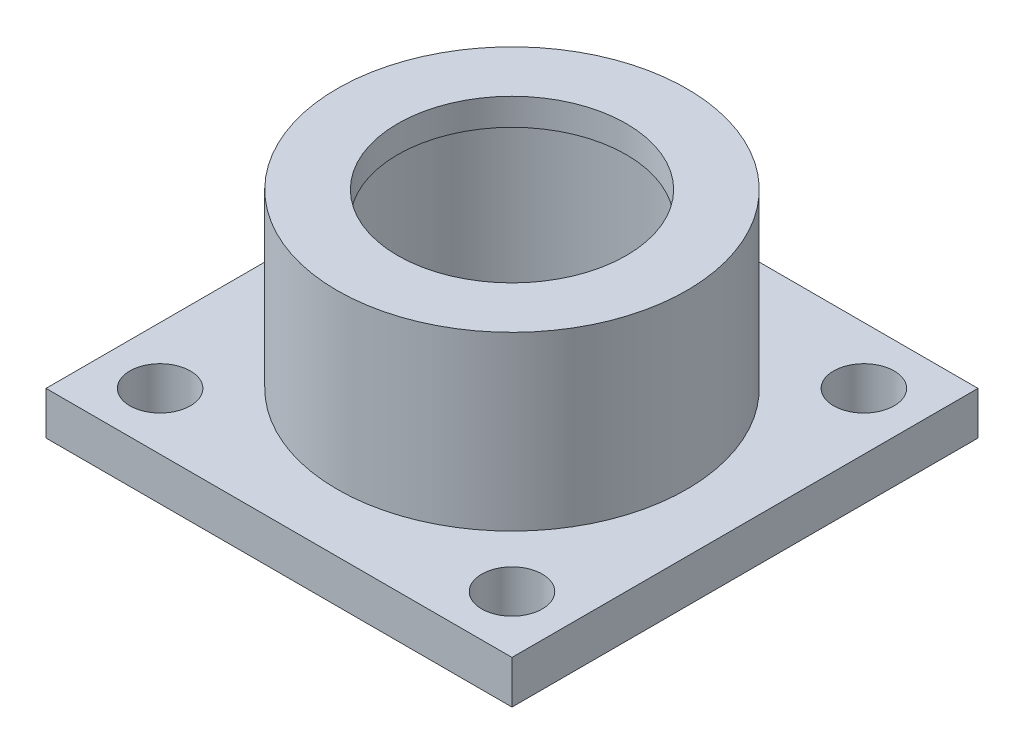
ISO-10303-21;
HEADER;
FILE_DESCRIPTION(('STEP AP214'),'2;1');
FILE_NAME('part.step','',(''),(''),'','','');
FILE_SCHEMA(('AUTOMOTIVE_DESIGN { 1 0 10303 214 1 1 1 1 }'));
ENDSEC;
DATA;
#1=APPLICATION_CONTEXT('core data for automotive mechanical design processes');
#2=APPLICATION_PROTOCOL_DEFINITION('international standard','automotive_design',2000,#1);
#3=PRODUCT_CONTEXT('',#1,'mechanical');
#4=PRODUCT('Part','Part','',(#3));
#5=PRODUCT_RELATED_PRODUCT_CATEGORY('part','',(#4));
#6=PRODUCT_DEFINITION_FORMATION('','',#4);
#7=PRODUCT_DEFINITION_CONTEXT('part definition',#1,'design');
#8=PRODUCT_DEFINITION('design','',#6,#7);
#9=PRODUCT_DEFINITION_SHAPE('','',#8);
#10=(LENGTH_UNIT() NAMED_UNIT(*) SI_UNIT(.MILLI.,.METRE.));
#11=(NAMED_UNIT(*) PLANE_ANGLE_UNIT() SI_UNIT($,.RADIAN.));
#12=(NAMED_UNIT(*) SI_UNIT($,.STERADIAN.) SOLID_ANGLE_UNIT());
#13=UNCERTAINTY_MEASURE_WITH_UNIT(LENGTH_MEASURE(1.E-05),#10,'distance_accuracy_value','');
#14=(GEOMETRIC_REPRESENTATION_CONTEXT(3) GLOBAL_UNCERTAINTY_ASSIGNED_CONTEXT((#13)) GLOBAL_UNIT_ASSIGNED_CONTEXT((#10,
#11,#12)) REPRESENTATION_CONTEXT('',''));
#15=CARTESIAN_POINT('',(0.,0.,0.));
#16=DIRECTION('',(0.,0.,1.));
#17=DIRECTION('',(1.,0.,0.));
#18=AXIS2_PLACEMENT_3D('',#15,#16,#17);
#19=CARTESIAN_POINT('',(-24.5,0.,0.));
#20=DIRECTION('',(0.,-1.,0.));
#21=DIRECTION('',(0.,0.,-1.));
#22=AXIS2_PLACEMENT_3D('',#19,#20,#21);
#23=PLANE('',#22);
#24=CARTESIAN_POINT('',(-13.0814754519511,0.,-13.0814754519511));
#25=DIRECTION('',(0.,1.,0.));
#26=DIRECTION('',(0.,0.,1.));
#27=AXIS2_PLACEMENT_3D('',#24,#25,#26);
#28=CIRCLE('',#27,2.25);
#29=CARTESIAN_POINT('',(-13.0814754519511,0.,-10.8314754519511));
#30=VERTEX_POINT('',#29);
#31=EDGE_CURVE('E113',#30,#30,#28,.T.);
#32=ORIENTED_EDGE('',*,*,#31,.T.);
#33=EDGE_LOOP('',(#32));
#34=FACE_BOUND('',#33,.T.);
#35=CARTESIAN_POINT('',(13.0814754519511,0.,-13.0814754519511));
#36=DIRECTION('',(0.,1.,0.));
#37=DIRECTION('',(0.,0.,1.));
#38=AXIS2_PLACEMENT_3D('',#35,#36,#37);
#39=CIRCLE('',#38,2.25);
#40=CARTESIAN_POINT('',(13.0814754519511,0.,-10.8314754519511));
#41=VERTEX_POINT('',#40);
#42=EDGE_CURVE('E119',#41,#41,#39,.T.);
#43=ORIENTED_EDGE('',*,*,#42,.T.);
#44=EDGE_LOOP('',(#43));
#45=FACE_BOUND('',#44,.T.);
#46=CARTESIAN_POINT('',(13.0814754519511,0.,13.0814754519511));
#47=DIRECTION('',(0.,1.,0.));
#48=DIRECTION('',(0.,0.,1.));
#49=AXIS2_PLACEMENT_3D('',#46,#47,#48);
#50=CIRCLE('',#49,2.25);
#51=CARTESIAN_POINT('',(13.0814754519511,0.,15.3314754519511));
#52=VERTEX_POINT('',#51);
#53=EDGE_CURVE('E125',#52,#52,#50,.T.);
#54=ORIENTED_EDGE('',*,*,#53,.T.);
#55=EDGE_LOOP('',(#54));
#56=FACE_BOUND('',#55,.T.);
#57=CARTESIAN_POINT('',(-13.0814754519511,0.,13.0814754519511));
#58=DIRECTION('',(0.,1.,0.));
#59=DIRECTION('',(0.,0.,1.));
#60=AXIS2_PLACEMENT_3D('',#57,#58,#59);
#61=CIRCLE('',#60,2.25);
#62=CARTESIAN_POINT('',(-13.0814754519511,0.,15.3314754519511));
#63=VERTEX_POINT('',#62);
#64=EDGE_CURVE('E131',#63,#63,#61,.T.);
#65=ORIENTED_EDGE('',*,*,#64,.T.);
#66=EDGE_LOOP('',(#65));
#67=FACE_BOUND('',#66,.T.);
#68=CARTESIAN_POINT('',(0.,0.,0.));
#69=DIRECTION('',(0.,1.,0.));
#70=DIRECTION('',(0.,0.,1.));
#71=AXIS2_PLACEMENT_3D('',#68,#69,#70);
#72=CIRCLE('',#71,11.);
#73=CARTESIAN_POINT('',(0.,0.,11.));
#74=VERTEX_POINT('',#73);
#75=EDGE_CURVE('E11',#74,#74,#72,.T.);
#76=ORIENTED_EDGE('',*,*,#75,.T.);
#77=EDGE_LOOP('',(#76));
#78=FACE_BOUND('',#77,.T.);
#79=DIRECTION('',(-1.,0.,0.));
#80=VECTOR('',#79,1.);
#81=CARTESIAN_POINT('',(-24.5,0.,17.3241161390704));
#82=LINE('',#81,#80);
#83=CARTESIAN_POINT('',(17.3241161390704,0.,17.3241161390704));
#84=VERTEX_POINT('',#83);
#85=CARTESIAN_POINT('',(-17.3241161390704,0.,17.3241161390704));
#86=VERTEX_POINT('',#85);
#87=EDGE_CURVE('E98',#84,#86,#82,.T.);
#88=ORIENTED_EDGE('',*,*,#87,.T.);
#89=DIRECTION('',(0.,0.,-1.));
#90=VECTOR('',#89,1.);
#91=CARTESIAN_POINT('',(-17.3241161390704,0.,0.));
#92=LINE('',#91,#90);
#93=CARTESIAN_POINT('',(-17.3241161390704,0.,-17.3241161390704));
#94=VERTEX_POINT('',#93);
#95=EDGE_CURVE('E107',#86,#94,#92,.T.);
#96=ORIENTED_EDGE('',*,*,#95,.T.);
#97=DIRECTION('',(1.,0.,0.));
#98=VECTOR('',#97,1.);
#99=CARTESIAN_POINT('',(-24.5,0.,-17.3241161390704));
#100=LINE('',#99,#98);
#101=CARTESIAN_POINT('',(17.3241161390704,0.,-17.3241161390704));
#102=VERTEX_POINT('',#101);
#103=EDGE_CURVE('E105',#94,#102,#100,.T.);
#104=ORIENTED_EDGE('',*,*,#103,.T.);
#105=DIRECTION('',(0.,0.,1.));
#106=VECTOR('',#105,1.);
#107=CARTESIAN_POINT('',(17.3241161390704,0.,0.));
#108=LINE('',#107,#106);
#109=EDGE_CURVE('E76',#102,#84,#108,.T.);
#110=ORIENTED_EDGE('',*,*,#109,.T.);
#111=EDGE_LOOP('',(#88,#96,#104,#110));
#112=FACE_BOUND('',#111,.T.);
#113=ADVANCED_FACE('F33',(#34,#45,#56,#67,#78,#112),#23,.T.);
#114=CARTESIAN_POINT('',(-13.,3.2,0.));
#115=DIRECTION('',(0.,1.,0.));
#116=DIRECTION('',(0.,0.,1.));
#117=AXIS2_PLACEMENT_3D('',#114,#115,#116);
#118=PLANE('',#117);
#119=CARTESIAN_POINT('',(-13.0814754519511,3.2,-13.0814754519511));
#120=DIRECTION('',(0.,1.,0.));
#121=DIRECTION('',(0.,0.,1.));
#122=AXIS2_PLACEMENT_3D('',#119,#120,#121);
#123=CIRCLE('',#122,2.25);
#124=CARTESIAN_POINT('',(-13.0814754519511,3.2,-10.8314754519511));
#125=VERTEX_POINT('',#124);
#126=EDGE_CURVE('E110',#125,#125,#123,.T.);
#127=ORIENTED_EDGE('',*,*,#126,.F.);
#128=EDGE_LOOP('',(#127));
#129=FACE_BOUND('',#128,.T.);
#130=CARTESIAN_POINT('',(13.0814754519511,3.2,-13.0814754519511));
#131=DIRECTION('',(0.,1.,0.));
#132=DIRECTION('',(0.,0.,1.));
#133=AXIS2_PLACEMENT_3D('',#130,#131,#132);
#134=CIRCLE('',#133,2.25);
#135=CARTESIAN_POINT('',(13.0814754519511,3.2,-10.8314754519511));
#136=VERTEX_POINT('',#135);
#137=EDGE_CURVE('E116',#136,#136,#134,.T.);
#138=ORIENTED_EDGE('',*,*,#137,.F.);
#139=EDGE_LOOP('',(#138));
#140=FACE_BOUND('',#139,.T.);
#141=CARTESIAN_POINT('',(13.0814754519511,3.2,13.0814754519511));
#142=DIRECTION('',(0.,1.,0.));
#143=DIRECTION('',(0.,0.,1.));
#144=AXIS2_PLACEMENT_3D('',#141,#142,#143);
#145=CIRCLE('',#144,2.25);
#146=CARTESIAN_POINT('',(13.0814754519511,3.2,15.3314754519511));
#147=VERTEX_POINT('',#146);
#148=EDGE_CURVE('E122',#147,#147,#145,.T.);
#149=ORIENTED_EDGE('',*,*,#148,.F.);
#150=EDGE_LOOP('',(#149));
#151=FACE_BOUND('',#150,.T.);
#152=CARTESIAN_POINT('',(-13.0814754519511,3.2,13.0814754519511));
#153=DIRECTION('',(0.,1.,0.));
#154=DIRECTION('',(0.,0.,1.));
#155=AXIS2_PLACEMENT_3D('',#152,#153,#154);
#156=CIRCLE('',#155,2.25);
#157=CARTESIAN_POINT('',(-13.0814754519511,3.2,15.3314754519511));
#158=VERTEX_POINT('',#157);
#159=EDGE_CURVE('E128',#158,#158,#156,.T.);
#160=ORIENTED_EDGE('',*,*,#159,.F.);
#161=EDGE_LOOP('',(#160));
#162=FACE_BOUND('',#161,.T.);
#163=CARTESIAN_POINT('',(0.,3.2,0.));
#164=DIRECTION('',(0.,1.,0.));
#165=DIRECTION('',(0.,0.,1.));
#166=AXIS2_PLACEMENT_3D('',#163,#164,#165);
#167=CIRCLE('',#166,13.);
#168=CARTESIAN_POINT('',(0.,3.2,13.));
#169=VERTEX_POINT('',#168);
#170=EDGE_CURVE('E134',#169,#169,#167,.T.);
#171=ORIENTED_EDGE('',*,*,#170,.F.);
#172=EDGE_LOOP('',(#171));
#173=FACE_BOUND('',#172,.T.);
#174=DIRECTION('',(-1.,0.,0.));
#175=VECTOR('',#174,1.);
#176=CARTESIAN_POINT('',(17.3241161390704,3.2,-17.3241161390704));
#177=LINE('',#176,#175);
#178=CARTESIAN_POINT('',(17.3241161390704,3.2,-17.3241161390704));
#179=VERTEX_POINT('',#178);
#180=CARTESIAN_POINT('',(-17.3241161390704,3.2,-17.3241161390704));
#181=VERTEX_POINT('',#180);
#182=EDGE_CURVE('E83',#179,#181,#177,.T.);
#183=ORIENTED_EDGE('',*,*,#182,.T.);
#184=DIRECTION('',(0.,0.,1.));
#185=VECTOR('',#184,1.);
#186=CARTESIAN_POINT('',(-17.3241161390704,3.2,17.3241161390704));
#187=LINE('',#186,#185);
#188=CARTESIAN_POINT('',(-17.3241161390704,3.2,17.3241161390704));
#189=VERTEX_POINT('',#188);
#190=EDGE_CURVE('E94',#181,#189,#187,.T.);
#191=ORIENTED_EDGE('',*,*,#190,.T.);
#192=DIRECTION('',(1.,0.,0.));
#193=VECTOR('',#192,1.);
#194=CARTESIAN_POINT('',(17.3241161390704,3.2,17.3241161390704));
#195=LINE('',#194,#193);
#196=CARTESIAN_POINT('',(17.3241161390704,3.2,17.3241161390704));
#197=VERTEX_POINT('',#196);
#198=EDGE_CURVE('E92',#189,#197,#195,.T.);
#199=ORIENTED_EDGE('',*,*,#198,.T.);
#200=DIRECTION('',(0.,0.,-1.));
#201=VECTOR('',#200,1.);
#202=CARTESIAN_POINT('',(17.3241161390704,3.2,17.3241161390704));
#203=LINE('',#202,#201);
#204=EDGE_CURVE('E55',#197,#179,#203,.T.);
#205=ORIENTED_EDGE('',*,*,#204,.T.);
#206=EDGE_LOOP('',(#183,#191,#199,#205));
#207=FACE_BOUND('',#206,.T.);
#208=ADVANCED_FACE('F91',(#129,#140,#151,#162,#173,#207),#118,.T.);
#209=CARTESIAN_POINT('',(0.,31.4651162790698,0.));
#210=DIRECTION('',(0.,1.,0.));
#211=DIRECTION('',(0.,0.,1.));
#212=AXIS2_PLACEMENT_3D('',#209,#210,#211);
#213=CYLINDRICAL_SURFACE('',#212,11.);
#214=CARTESIAN_POINT('',(0.,14.,0.));
#215=DIRECTION('',(0.,1.,0.));
#216=DIRECTION('',(0.,0.,1.));
#217=AXIS2_PLACEMENT_3D('',#214,#215,#216);
#218=CIRCLE('',#217,11.);
#219=CARTESIAN_POINT('',(0.,14.,11.));
#220=VERTEX_POINT('',#219);
#221=EDGE_CURVE('E40',#220,#220,#218,.T.);
#222=ORIENTED_EDGE('',*,*,#221,.T.);
#223=EDGE_LOOP('',(#222));
#224=FACE_BOUND('',#223,.T.);
#225=ORIENTED_EDGE('',*,*,#75,.F.);
#226=EDGE_LOOP('',(#225));
#227=FACE_BOUND('',#226,.T.);
#228=ADVANCED_FACE('F148',(#224,#227),#213,.F.);
#229=CARTESIAN_POINT('',(-8.5,14.,0.));
#230=DIRECTION('',(0.,-1.,0.));
#231=DIRECTION('',(0.,0.,-1.));
#232=AXIS2_PLACEMENT_3D('',#229,#230,#231);
#233=PLANE('',#232);
#234=CARTESIAN_POINT('',(0.,14.,0.));
#235=DIRECTION('',(0.,1.,0.));
#236=DIRECTION('',(0.,0.,1.));
#237=AXIS2_PLACEMENT_3D('',#234,#235,#236);
#238=CIRCLE('',#237,8.5);
#239=CARTESIAN_POINT('',(0.,14.,8.5));
#240=VERTEX_POINT('',#239);
#241=EDGE_CURVE('E143',#240,#240,#238,.T.);
#242=ORIENTED_EDGE('',*,*,#241,.T.);
#243=EDGE_LOOP('',(#242));
#244=FACE_BOUND('',#243,.T.);
#245=ORIENTED_EDGE('',*,*,#221,.F.);
#246=EDGE_LOOP('',(#245));
#247=FACE_BOUND('',#246,.T.);
#248=ADVANCED_FACE('F151',(#244,#247),#233,.T.);
#249=CARTESIAN_POINT('',(0.,31.4651162790698,0.));
#250=DIRECTION('',(0.,1.,0.));
#251=DIRECTION('',(0.,0.,1.));
#252=AXIS2_PLACEMENT_3D('',#249,#250,#251);
#253=CYLINDRICAL_SURFACE('',#252,8.5);
#254=CARTESIAN_POINT('',(0.,16.,0.));
#255=DIRECTION('',(0.,1.,0.));
#256=DIRECTION('',(0.,0.,1.));
#257=AXIS2_PLACEMENT_3D('',#254,#255,#256);
#258=CIRCLE('',#257,8.5);
#259=CARTESIAN_POINT('',(0.,16.,8.5));
#260=VERTEX_POINT('',#259);
#261=EDGE_CURVE('E140',#260,#260,#258,.T.);
#262=ORIENTED_EDGE('',*,*,#261,.T.);
#263=EDGE_LOOP('',(#262));
#264=FACE_BOUND('',#263,.T.);
#265=ORIENTED_EDGE('',*,*,#241,.F.);
#266=EDGE_LOOP('',(#265));
#267=FACE_BOUND('',#266,.T.);
#268=ADVANCED_FACE('F153',(#264,#267),#253,.F.);
#269=CARTESIAN_POINT('',(-13.,16.,0.));
#270=DIRECTION('',(0.,1.,0.));
#271=DIRECTION('',(0.,0.,1.));
#272=AXIS2_PLACEMENT_3D('',#269,#270,#271);
#273=PLANE('',#272);
#274=CARTESIAN_POINT('',(0.,16.,0.));
#275=DIRECTION('',(0.,1.,0.));
#276=DIRECTION('',(0.,0.,1.));
#277=AXIS2_PLACEMENT_3D('',#274,#275,#276);
#278=CIRCLE('',#277,13.);
#279=CARTESIAN_POINT('',(0.,16.,13.));
#280=VERTEX_POINT('',#279);
#281=EDGE_CURVE('E137',#280,#280,#278,.T.);
#282=ORIENTED_EDGE('',*,*,#281,.T.);
#283=EDGE_LOOP('',(#282));
#284=FACE_BOUND('',#283,.T.);
#285=ORIENTED_EDGE('',*,*,#261,.F.);
#286=EDGE_LOOP('',(#285));
#287=FACE_BOUND('',#286,.T.);
#288=ADVANCED_FACE('F160',(#284,#287),#273,.T.);
#289=CARTESIAN_POINT('',(0.,31.4651162790698,0.));
#290=DIRECTION('',(0.,1.,0.));
#291=DIRECTION('',(0.,0.,1.));
#292=AXIS2_PLACEMENT_3D('',#289,#290,#291);
#293=CYLINDRICAL_SURFACE('',#292,13.);
#294=ORIENTED_EDGE('',*,*,#170,.T.);
#295=EDGE_LOOP('',(#294));
#296=FACE_BOUND('',#295,.T.);
#297=ORIENTED_EDGE('',*,*,#281,.F.);
#298=EDGE_LOOP('',(#297));
#299=FACE_BOUND('',#298,.T.);
#300=ADVANCED_FACE('F206',(#296,#299),#293,.T.);
#301=CARTESIAN_POINT('',(-13.0814754519511,3.2,13.0814754519511));
#302=DIRECTION('',(0.,1.,0.));
#303=DIRECTION('',(0.,0.,1.));
#304=AXIS2_PLACEMENT_3D('',#301,#302,#303);
#305=CYLINDRICAL_SURFACE('',#304,2.25);
#306=ORIENTED_EDGE('',*,*,#64,.F.);
#307=EDGE_LOOP('',(#306));
#308=FACE_BOUND('',#307,.T.);
#309=ORIENTED_EDGE('',*,*,#159,.T.);
#310=EDGE_LOOP('',(#309));
#311=FACE_BOUND('',#310,.T.);
#312=ADVANCED_FACE('F203',(#308,#311),#305,.F.);
#313=CARTESIAN_POINT('',(13.0814754519511,3.2,13.0814754519511));
#314=DIRECTION('',(0.,1.,0.));
#315=DIRECTION('',(0.,0.,1.));
#316=AXIS2_PLACEMENT_3D('',#313,#314,#315);
#317=CYLINDRICAL_SURFACE('',#316,2.25);
#318=ORIENTED_EDGE('',*,*,#53,.F.);
#319=EDGE_LOOP('',(#318));
#320=FACE_BOUND('',#319,.T.);
#321=ORIENTED_EDGE('',*,*,#148,.T.);
#322=EDGE_LOOP('',(#321));
#323=FACE_BOUND('',#322,.T.);
#324=ADVANCED_FACE('F199',(#320,#323),#317,.F.);
#325=CARTESIAN_POINT('',(13.0814754519511,3.2,-13.0814754519511));
#326=DIRECTION('',(0.,1.,0.));
#327=DIRECTION('',(0.,0.,1.));
#328=AXIS2_PLACEMENT_3D('',#325,#326,#327);
#329=CYLINDRICAL_SURFACE('',#328,2.25);
#330=ORIENTED_EDGE('',*,*,#42,.F.);
#331=EDGE_LOOP('',(#330));
#332=FACE_BOUND('',#331,.T.);
#333=ORIENTED_EDGE('',*,*,#137,.T.);
#334=EDGE_LOOP('',(#333));
#335=FACE_BOUND('',#334,.T.);
#336=ADVANCED_FACE('F191',(#332,#335),#329,.F.);
#337=CARTESIAN_POINT('',(-13.0814754519511,3.2,-13.0814754519511));
#338=DIRECTION('',(0.,1.,0.));
#339=DIRECTION('',(0.,0.,1.));
#340=AXIS2_PLACEMENT_3D('',#337,#338,#339);
#341=CYLINDRICAL_SURFACE('',#340,2.25);
#342=ORIENTED_EDGE('',*,*,#31,.F.);
#343=EDGE_LOOP('',(#342));
#344=FACE_BOUND('',#343,.T.);
#345=ORIENTED_EDGE('',*,*,#126,.T.);
#346=EDGE_LOOP('',(#345));
#347=FACE_BOUND('',#346,.T.);
#348=ADVANCED_FACE('F184',(#344,#347),#341,.F.);
#349=CARTESIAN_POINT('',(-17.3241161390704,-6.8,17.3241161390704));
#350=DIRECTION('',(-1.,0.,0.));
#351=DIRECTION('',(0.,0.,1.));
#352=AXIS2_PLACEMENT_3D('',#349,#350,#351);
#353=PLANE('',#352);
#354=DIRECTION('',(0.,1.,0.));
#355=VECTOR('',#354,1.);
#356=CARTESIAN_POINT('',(-17.3241161390704,-6.8,17.3241161390704));
#357=LINE('',#356,#355);
#358=EDGE_CURVE('E47',#86,#189,#357,.T.);
#359=ORIENTED_EDGE('',*,*,#358,.T.);
#360=ORIENTED_EDGE('',*,*,#190,.F.);
#361=DIRECTION('',(0.,1.,0.));
#362=VECTOR('',#361,1.);
#363=CARTESIAN_POINT('',(-17.3241161390704,-6.8,-17.3241161390704));
#364=LINE('',#363,#362);
#365=EDGE_CURVE('E79',#94,#181,#364,.T.);
#366=ORIENTED_EDGE('',*,*,#365,.F.);
#367=ORIENTED_EDGE('',*,*,#95,.F.);
#368=EDGE_LOOP('',(#359,#360,#366,#367));
#369=FACE_BOUND('',#368,.T.);
#370=ADVANCED_FACE('F182',(#369),#353,.T.);
#371=CARTESIAN_POINT('',(17.3241161390704,-6.8,-17.3241161390704));
#372=DIRECTION('',(0.,0.,-1.));
#373=DIRECTION('',(-1.,0.,0.));
#374=AXIS2_PLACEMENT_3D('',#371,#372,#373);
#375=PLANE('',#374);
#376=ORIENTED_EDGE('',*,*,#365,.T.);
#377=ORIENTED_EDGE('',*,*,#182,.F.);
#378=DIRECTION('',(0.,1.,0.));
#379=VECTOR('',#378,1.);
#380=CARTESIAN_POINT('',(17.3241161390704,-6.8,-17.3241161390704));
#381=LINE('',#380,#379);
#382=EDGE_CURVE('E72',#102,#179,#381,.T.);
#383=ORIENTED_EDGE('',*,*,#382,.F.);
#384=ORIENTED_EDGE('',*,*,#103,.F.);
#385=EDGE_LOOP('',(#376,#377,#383,#384));
#386=FACE_BOUND('',#385,.T.);
#387=ADVANCED_FACE('F84',(#386),#375,.T.);
#388=CARTESIAN_POINT('',(17.3241161390704,-6.8,17.3241161390704));
#389=DIRECTION('',(1.,0.,0.));
#390=DIRECTION('',(0.,0.,-1.));
#391=AXIS2_PLACEMENT_3D('',#388,#389,#390);
#392=PLANE('',#391);
#393=ORIENTED_EDGE('',*,*,#382,.T.);
#394=ORIENTED_EDGE('',*,*,#204,.F.);
#395=DIRECTION('',(0.,1.,0.));
#396=VECTOR('',#395,1.);
#397=CARTESIAN_POINT('',(17.3241161390704,-6.8,17.3241161390704));
#398=LINE('',#397,#396);
#399=EDGE_CURVE('E80',#84,#197,#398,.T.);
#400=ORIENTED_EDGE('',*,*,#399,.F.);
#401=ORIENTED_EDGE('',*,*,#109,.F.);
#402=EDGE_LOOP('',(#393,#394,#400,#401));
#403=FACE_BOUND('',#402,.T.);
#404=ADVANCED_FACE('F74',(#403),#392,.T.);
#405=CARTESIAN_POINT('',(17.3241161390704,-6.8,17.3241161390704));
#406=DIRECTION('',(0.,0.,1.));
#407=DIRECTION('',(1.,0.,0.));
#408=AXIS2_PLACEMENT_3D('',#405,#406,#407);
#409=PLANE('',#408);
#410=ORIENTED_EDGE('',*,*,#399,.T.);
#411=ORIENTED_EDGE('',*,*,#198,.F.);
#412=ORIENTED_EDGE('',*,*,#358,.F.);
#413=ORIENTED_EDGE('',*,*,#87,.F.);
#414=EDGE_LOOP('',(#410,#411,#412,#413));
#415=FACE_BOUND('',#414,.T.);
#416=ADVANCED_FACE('F180',(#415),#409,.T.);
#417=CLOSED_SHELL('',(#113,#208,#228,#248,#268,#288,#300,#312,#324,#336,#348,#370,#387,#404,#416));
#418=MANIFOLD_SOLID_BREP('B2',#417);
#419=ADVANCED_BREP_SHAPE_REPRESENTATION('',(#18,#418),#14);
#420=SHAPE_DEFINITION_REPRESENTATION(#9,#419);
ENDSEC;
END-ISO-10303-21;
